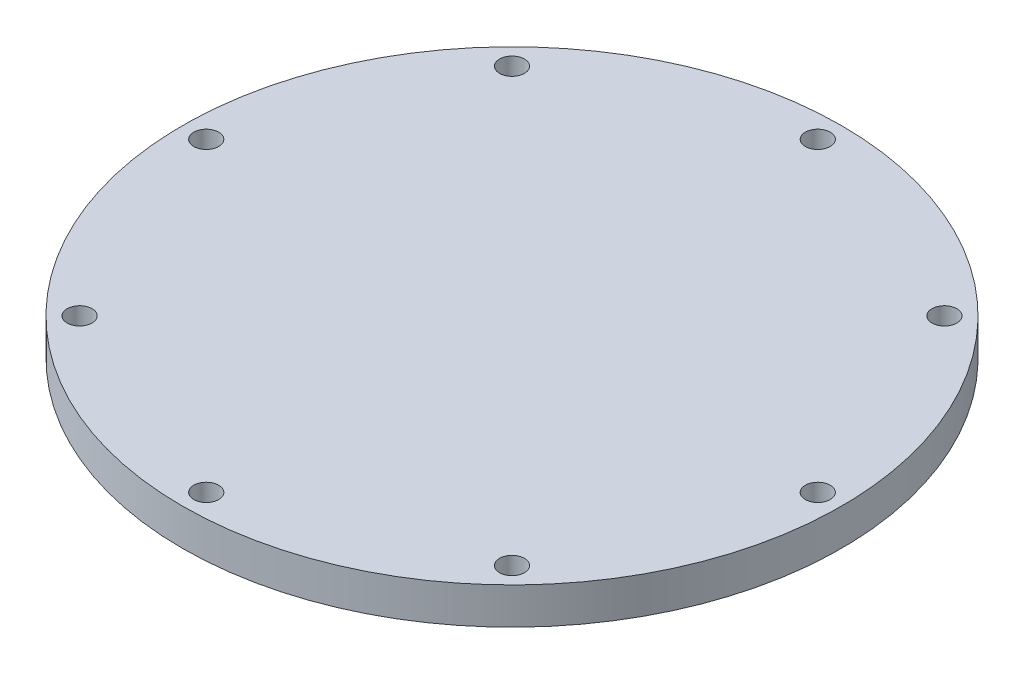
ISO-10303-21;
HEADER;
FILE_DESCRIPTION(('STEP AP214'),'2;1');
FILE_NAME('part.step','',(''),(''),'','','');
FILE_SCHEMA(('AUTOMOTIVE_DESIGN { 1 0 10303 214 1 1 1 1 }'));
ENDSEC;
DATA;
#1=APPLICATION_CONTEXT('core data for automotive mechanical design processes');
#2=APPLICATION_PROTOCOL_DEFINITION('international standard','automotive_design',2000,#1);
#3=PRODUCT_CONTEXT('',#1,'mechanical');
#4=PRODUCT('Part','Part','',(#3));
#5=PRODUCT_RELATED_PRODUCT_CATEGORY('part','',(#4));
#6=PRODUCT_DEFINITION_FORMATION('','',#4);
#7=PRODUCT_DEFINITION_CONTEXT('part definition',#1,'design');
#8=PRODUCT_DEFINITION('design','',#6,#7);
#9=PRODUCT_DEFINITION_SHAPE('','',#8);
#10=(LENGTH_UNIT() NAMED_UNIT(*) SI_UNIT(.MILLI.,.METRE.));
#11=(NAMED_UNIT(*) PLANE_ANGLE_UNIT() SI_UNIT($,.RADIAN.));
#12=(NAMED_UNIT(*) SI_UNIT($,.STERADIAN.) SOLID_ANGLE_UNIT());
#13=UNCERTAINTY_MEASURE_WITH_UNIT(LENGTH_MEASURE(1.E-05),#10,'distance_accuracy_value','');
#14=(GEOMETRIC_REPRESENTATION_CONTEXT(3) GLOBAL_UNCERTAINTY_ASSIGNED_CONTEXT((#13)) GLOBAL_UNIT_ASSIGNED_CONTEXT((#10,
#11,#12)) REPRESENTATION_CONTEXT('',''));
#15=CARTESIAN_POINT('',(0.,0.,0.));
#16=DIRECTION('',(0.,0.,1.));
#17=DIRECTION('',(1.,0.,0.));
#18=AXIS2_PLACEMENT_3D('',#15,#16,#17);
#19=CARTESIAN_POINT('',(0.,5.,0.));
#20=DIRECTION('',(0.,1.,0.));
#21=DIRECTION('',(0.,0.,1.));
#22=AXIS2_PLACEMENT_3D('',#19,#20,#21);
#23=PLANE('',#22);
#24=CARTESIAN_POINT('',(1.02206257963007E-12,5.,-41.7500000000013));
#25=DIRECTION('',(0.,1.,0.));
#26=DIRECTION('',(0.,0.,1.));
#27=AXIS2_PLACEMENT_3D('',#24,#25,#26);
#28=CIRCLE('',#27,1.7);
#29=CARTESIAN_POINT('',(1.02206257963007E-12,5.,-40.0500000000012));
#30=VERTEX_POINT('',#29);
#31=EDGE_CURVE('E100',#30,#30,#28,.T.);
#32=ORIENTED_EDGE('',*,*,#31,.F.);
#33=EDGE_LOOP('',(#32));
#34=FACE_BOUND('',#33,.T.);
#35=CARTESIAN_POINT('',(29.52170811454,5.,-29.5217081145385));
#36=DIRECTION('',(0.,1.,0.));
#37=DIRECTION('',(0.,0.,1.));
#38=AXIS2_PLACEMENT_3D('',#35,#36,#37);
#39=CIRCLE('',#38,1.7);
#40=CARTESIAN_POINT('',(29.52170811454,5.,-27.8217081145385));
#41=VERTEX_POINT('',#40);
#42=EDGE_CURVE('E104',#41,#41,#39,.T.);
#43=ORIENTED_EDGE('',*,*,#42,.F.);
#44=EDGE_LOOP('',(#43));
#45=FACE_BOUND('',#44,.T.);
#46=CARTESIAN_POINT('',(41.7500000000013,5.,1.16783192552678E-12));
#47=DIRECTION('',(0.,1.,0.));
#48=DIRECTION('',(0.,0.,1.));
#49=AXIS2_PLACEMENT_3D('',#46,#47,#48);
#50=CIRCLE('',#49,1.7);
#51=CARTESIAN_POINT('',(41.7500000000013,5.,1.70000000000117));
#52=VERTEX_POINT('',#51);
#53=EDGE_CURVE('E107',#52,#52,#50,.T.);
#54=ORIENTED_EDGE('',*,*,#53,.F.);
#55=EDGE_LOOP('',(#54));
#56=FACE_BOUND('',#55,.T.);
#57=CARTESIAN_POINT('',(29.5217081145384,5.,29.5217081145401));
#58=DIRECTION('',(0.,1.,0.));
#59=DIRECTION('',(0.,0.,1.));
#60=AXIS2_PLACEMENT_3D('',#57,#58,#59);
#61=CIRCLE('',#60,1.7);
#62=CARTESIAN_POINT('',(29.5217081145384,5.,31.2217081145401));
#63=VERTEX_POINT('',#62);
#64=EDGE_CURVE('E110',#63,#63,#61,.T.);
#65=ORIENTED_EDGE('',*,*,#64,.F.);
#66=EDGE_LOOP('',(#65));
#67=FACE_BOUND('',#66,.T.);
#68=CARTESIAN_POINT('',(-1.31360127142348E-12,5.,41.7500000000013));
#69=DIRECTION('',(0.,1.,0.));
#70=DIRECTION('',(0.,0.,1.));
#71=AXIS2_PLACEMENT_3D('',#68,#69,#70);
#72=CIRCLE('',#71,1.7);
#73=CARTESIAN_POINT('',(-1.31360127142348E-12,5.,43.4500000000013));
#74=VERTEX_POINT('',#73);
#75=EDGE_CURVE('E113',#74,#74,#72,.T.);
#76=ORIENTED_EDGE('',*,*,#75,.F.);
#77=EDGE_LOOP('',(#76));
#78=FACE_BOUND('',#77,.T.);
#79=CARTESIAN_POINT('',(-29.5217081145402,5.,29.5217081145383));
#80=DIRECTION('',(0.,1.,0.));
#81=DIRECTION('',(0.,0.,1.));
#82=AXIS2_PLACEMENT_3D('',#79,#80,#81);
#83=CIRCLE('',#82,1.7);
#84=CARTESIAN_POINT('',(-29.5217081145402,5.,31.2217081145383));
#85=VERTEX_POINT('',#84);
#86=EDGE_CURVE('E116',#85,#85,#83,.T.);
#87=ORIENTED_EDGE('',*,*,#86,.F.);
#88=EDGE_LOOP('',(#87));
#89=FACE_BOUND('',#88,.T.);
#90=CARTESIAN_POINT('',(-41.7500000000013,5.,-1.45937061732019E-12));
#91=DIRECTION('',(0.,1.,0.));
#92=DIRECTION('',(0.,0.,1.));
#93=AXIS2_PLACEMENT_3D('',#90,#91,#92);
#94=CIRCLE('',#93,1.7);
#95=CARTESIAN_POINT('',(-41.7500000000013,5.,1.69999999999854));
#96=VERTEX_POINT('',#95);
#97=EDGE_CURVE('E119',#96,#96,#94,.T.);
#98=ORIENTED_EDGE('',*,*,#97,.F.);
#99=EDGE_LOOP('',(#98));
#100=FACE_BOUND('',#99,.T.);
#101=CARTESIAN_POINT('',(-29.5217081145382,5.,-29.5217081145403));
#102=DIRECTION('',(0.,1.,0.));
#103=DIRECTION('',(0.,0.,1.));
#104=AXIS2_PLACEMENT_3D('',#101,#102,#103);
#105=CIRCLE('',#104,1.7);
#106=CARTESIAN_POINT('',(-29.5217081145382,5.,-27.8217081145403));
#107=VERTEX_POINT('',#106);
#108=EDGE_CURVE('E99',#107,#107,#105,.T.);
#109=ORIENTED_EDGE('',*,*,#108,.F.);
#110=EDGE_LOOP('',(#109));
#111=FACE_BOUND('',#110,.T.);
#112=CARTESIAN_POINT('',(0.,5.,0.));
#113=DIRECTION('',(0.,1.,0.));
#114=DIRECTION('',(0.,0.,1.));
#115=AXIS2_PLACEMENT_3D('',#112,#113,#114);
#116=CIRCLE('',#115,45.);
#117=CARTESIAN_POINT('',(0.,5.,45.));
#118=VERTEX_POINT('',#117);
#119=EDGE_CURVE('E137',#118,#118,#116,.T.);
#120=ORIENTED_EDGE('',*,*,#119,.T.);
#121=EDGE_LOOP('',(#120));
#122=FACE_BOUND('',#121,.T.);
#123=ADVANCED_FACE('F43',(#34,#45,#56,#67,#78,#89,#100,#111,#122),#23,.T.);
#124=CARTESIAN_POINT('',(0.,0.,0.));
#125=DIRECTION('',(0.,1.,0.));
#126=DIRECTION('',(0.,0.,1.));
#127=AXIS2_PLACEMENT_3D('',#124,#125,#126);
#128=PLANE('',#127);
#129=CARTESIAN_POINT('',(1.02206257963007E-12,0.,-41.7500000000013));
#130=DIRECTION('',(0.,1.,0.));
#131=DIRECTION('',(0.,0.,1.));
#132=AXIS2_PLACEMENT_3D('',#129,#130,#131);
#133=CIRCLE('',#132,1.7);
#134=CARTESIAN_POINT('',(1.02206257963007E-12,0.,-40.0500000000012));
#135=VERTEX_POINT('',#134);
#136=EDGE_CURVE('E47',#135,#135,#133,.T.);
#137=ORIENTED_EDGE('',*,*,#136,.T.);
#138=EDGE_LOOP('',(#137));
#139=FACE_BOUND('',#138,.T.);
#140=CARTESIAN_POINT('',(29.52170811454,0.,-29.5217081145385));
#141=DIRECTION('',(0.,1.,0.));
#142=DIRECTION('',(0.,0.,1.));
#143=AXIS2_PLACEMENT_3D('',#140,#141,#142);
#144=CIRCLE('',#143,1.7);
#145=CARTESIAN_POINT('',(29.52170811454,0.,-27.8217081145385));
#146=VERTEX_POINT('',#145);
#147=EDGE_CURVE('E166',#146,#146,#144,.T.);
#148=ORIENTED_EDGE('',*,*,#147,.T.);
#149=EDGE_LOOP('',(#148));
#150=FACE_BOUND('',#149,.T.);
#151=CARTESIAN_POINT('',(41.7500000000013,0.,1.16783192552678E-12));
#152=DIRECTION('',(0.,1.,0.));
#153=DIRECTION('',(0.,0.,1.));
#154=AXIS2_PLACEMENT_3D('',#151,#152,#153);
#155=CIRCLE('',#154,1.7);
#156=CARTESIAN_POINT('',(41.7500000000013,0.,1.70000000000117));
#157=VERTEX_POINT('',#156);
#158=EDGE_CURVE('E164',#157,#157,#155,.T.);
#159=ORIENTED_EDGE('',*,*,#158,.T.);
#160=EDGE_LOOP('',(#159));
#161=FACE_BOUND('',#160,.T.);
#162=CARTESIAN_POINT('',(29.5217081145384,0.,29.5217081145401));
#163=DIRECTION('',(0.,1.,0.));
#164=DIRECTION('',(0.,0.,1.));
#165=AXIS2_PLACEMENT_3D('',#162,#163,#164);
#166=CIRCLE('',#165,1.7);
#167=CARTESIAN_POINT('',(29.5217081145384,0.,31.2217081145401));
#168=VERTEX_POINT('',#167);
#169=EDGE_CURVE('E161',#168,#168,#166,.T.);
#170=ORIENTED_EDGE('',*,*,#169,.T.);
#171=EDGE_LOOP('',(#170));
#172=FACE_BOUND('',#171,.T.);
#173=CARTESIAN_POINT('',(-1.31360127142348E-12,0.,41.7500000000013));
#174=DIRECTION('',(0.,1.,0.));
#175=DIRECTION('',(0.,0.,1.));
#176=AXIS2_PLACEMENT_3D('',#173,#174,#175);
#177=CIRCLE('',#176,1.7);
#178=CARTESIAN_POINT('',(-1.31360127142348E-12,0.,43.4500000000013));
#179=VERTEX_POINT('',#178);
#180=EDGE_CURVE('E158',#179,#179,#177,.T.);
#181=ORIENTED_EDGE('',*,*,#180,.T.);
#182=EDGE_LOOP('',(#181));
#183=FACE_BOUND('',#182,.T.);
#184=CARTESIAN_POINT('',(-29.5217081145402,0.,29.5217081145383));
#185=DIRECTION('',(0.,1.,0.));
#186=DIRECTION('',(0.,0.,1.));
#187=AXIS2_PLACEMENT_3D('',#184,#185,#186);
#188=CIRCLE('',#187,1.7);
#189=CARTESIAN_POINT('',(-29.5217081145402,0.,31.2217081145383));
#190=VERTEX_POINT('',#189);
#191=EDGE_CURVE('E155',#190,#190,#188,.T.);
#192=ORIENTED_EDGE('',*,*,#191,.T.);
#193=EDGE_LOOP('',(#192));
#194=FACE_BOUND('',#193,.T.);
#195=CARTESIAN_POINT('',(-41.7500000000013,0.,-1.45937061732019E-12));
#196=DIRECTION('',(0.,1.,0.));
#197=DIRECTION('',(0.,0.,1.));
#198=AXIS2_PLACEMENT_3D('',#195,#196,#197);
#199=CIRCLE('',#198,1.7);
#200=CARTESIAN_POINT('',(-41.7500000000013,0.,1.69999999999854));
#201=VERTEX_POINT('',#200);
#202=EDGE_CURVE('E152',#201,#201,#199,.T.);
#203=ORIENTED_EDGE('',*,*,#202,.T.);
#204=EDGE_LOOP('',(#203));
#205=FACE_BOUND('',#204,.T.);
#206=CARTESIAN_POINT('',(-29.5217081145382,0.,-29.5217081145403));
#207=DIRECTION('',(0.,1.,0.));
#208=DIRECTION('',(0.,0.,1.));
#209=AXIS2_PLACEMENT_3D('',#206,#207,#208);
#210=CIRCLE('',#209,1.7);
#211=CARTESIAN_POINT('',(-29.5217081145382,0.,-27.8217081145403));
#212=VERTEX_POINT('',#211);
#213=EDGE_CURVE('E103',#212,#212,#210,.T.);
#214=ORIENTED_EDGE('',*,*,#213,.T.);
#215=EDGE_LOOP('',(#214));
#216=FACE_BOUND('',#215,.T.);
#217=CARTESIAN_POINT('',(27.,0.,0.));
#218=DIRECTION('',(0.,1.,0.));
#219=DIRECTION('',(0.,0.,1.));
#220=AXIS2_PLACEMENT_3D('',#217,#218,#219);
#221=CIRCLE('',#220,3.937);
#222=CARTESIAN_POINT('',(27.,0.,3.937));
#223=VERTEX_POINT('',#222);
#224=EDGE_CURVE('E11',#223,#223,#221,.F.);
#225=ORIENTED_EDGE('',*,*,#224,.F.);
#226=EDGE_LOOP('',(#225));
#227=FACE_BOUND('',#226,.T.);
#228=CARTESIAN_POINT('',(0.,0.,-27.));
#229=DIRECTION('',(0.,1.,0.));
#230=DIRECTION('',(0.,0.,1.));
#231=AXIS2_PLACEMENT_3D('',#228,#229,#230);
#232=CIRCLE('',#231,3.937);
#233=CARTESIAN_POINT('',(0.,0.,-23.063));
#234=VERTEX_POINT('',#233);
#235=EDGE_CURVE('E52',#234,#234,#232,.F.);
#236=ORIENTED_EDGE('',*,*,#235,.F.);
#237=EDGE_LOOP('',(#236));
#238=FACE_BOUND('',#237,.T.);
#239=CARTESIAN_POINT('',(-27.,0.,1.88539992297529E-13));
#240=DIRECTION('',(0.,1.,0.));
#241=DIRECTION('',(0.,0.,1.));
#242=AXIS2_PLACEMENT_3D('',#239,#240,#241);
#243=CIRCLE('',#242,3.937);
#244=CARTESIAN_POINT('',(-27.,0.,3.93700000000019));
#245=VERTEX_POINT('',#244);
#246=EDGE_CURVE('E145',#245,#245,#243,.F.);
#247=ORIENTED_EDGE('',*,*,#246,.F.);
#248=EDGE_LOOP('',(#247));
#249=FACE_BOUND('',#248,.T.);
#250=CARTESIAN_POINT('',(2.82809988446294E-13,0.,27.));
#251=DIRECTION('',(0.,1.,0.));
#252=DIRECTION('',(0.,0.,1.));
#253=AXIS2_PLACEMENT_3D('',#250,#251,#252);
#254=CIRCLE('',#253,3.937);
#255=CARTESIAN_POINT('',(2.82809988446294E-13,0.,30.937));
#256=VERTEX_POINT('',#255);
#257=EDGE_CURVE('E140',#256,#256,#254,.F.);
#258=ORIENTED_EDGE('',*,*,#257,.F.);
#259=EDGE_LOOP('',(#258));
#260=FACE_BOUND('',#259,.T.);
#261=CARTESIAN_POINT('',(0.,0.,0.));
#262=DIRECTION('',(0.,1.,0.));
#263=DIRECTION('',(0.,0.,1.));
#264=AXIS2_PLACEMENT_3D('',#261,#262,#263);
#265=CIRCLE('',#264,45.);
#266=CARTESIAN_POINT('',(0.,0.,45.));
#267=VERTEX_POINT('',#266);
#268=EDGE_CURVE('E127',#267,#267,#265,.T.);
#269=ORIENTED_EDGE('',*,*,#268,.F.);
#270=EDGE_LOOP('',(#269));
#271=FACE_BOUND('',#270,.T.);
#272=ADVANCED_FACE('F173',(#139,#150,#161,#172,#183,#194,#205,#216,#227,#238,#249,#260,#271),
#128,.F.);
#273=CARTESIAN_POINT('',(0.,5.,0.));
#274=DIRECTION('',(0.,-1.,0.));
#275=DIRECTION('',(0.,0.,-1.));
#276=AXIS2_PLACEMENT_3D('',#273,#274,#275);
#277=CYLINDRICAL_SURFACE('',#276,45.);
#278=ORIENTED_EDGE('',*,*,#119,.F.);
#279=EDGE_LOOP('',(#278));
#280=FACE_BOUND('',#279,.T.);
#281=ORIENTED_EDGE('',*,*,#268,.T.);
#282=EDGE_LOOP('',(#281));
#283=FACE_BOUND('',#282,.T.);
#284=ADVANCED_FACE('F45',(#280,#283),#277,.T.);
#285=CARTESIAN_POINT('',(2.82809988446294E-13,-4.,27.));
#286=DIRECTION('',(0.,1.,0.));
#287=DIRECTION('',(0.,0.,1.));
#288=AXIS2_PLACEMENT_3D('',#285,#286,#287);
#289=CYLINDRICAL_SURFACE('',#288,3.937);
#290=CARTESIAN_POINT('',(2.82809988446294E-13,-4.,27.));
#291=DIRECTION('',(0.,-1.,0.));
#292=DIRECTION('',(0.,0.,-1.));
#293=AXIS2_PLACEMENT_3D('',#290,#291,#292);
#294=CIRCLE('',#293,3.937);
#295=CARTESIAN_POINT('',(2.82809988446294E-13,-4.,23.063));
#296=VERTEX_POINT('',#295);
#297=EDGE_CURVE('E134',#296,#296,#294,.T.);
#298=ORIENTED_EDGE('',*,*,#297,.F.);
#299=EDGE_LOOP('',(#298));
#300=FACE_BOUND('',#299,.T.);
#301=ORIENTED_EDGE('',*,*,#257,.T.);
#302=EDGE_LOOP('',(#301));
#303=FACE_BOUND('',#302,.T.);
#304=ADVANCED_FACE('F205',(#300,#303),#289,.T.);
#305=CARTESIAN_POINT('',(2.82809988446294E-13,-4.,27.));
#306=DIRECTION('',(0.,-1.,0.));
#307=DIRECTION('',(0.,0.,-1.));
#308=AXIS2_PLACEMENT_3D('',#305,#306,#307);
#309=PLANE('',#308);
#310=CARTESIAN_POINT('',(2.82809988446294E-13,-4.,27.));
#311=DIRECTION('',(0.,-1.,0.));
#312=DIRECTION('',(0.,0.,-1.));
#313=AXIS2_PLACEMENT_3D('',#310,#311,#312);
#314=CIRCLE('',#313,1.24999999999999);
#315=CARTESIAN_POINT('',(2.82809988446294E-13,-4.,25.75));
#316=VERTEX_POINT('',#315);
#317=EDGE_CURVE('E77',#316,#316,#314,.T.);
#318=ORIENTED_EDGE('',*,*,#317,.F.);
#319=EDGE_LOOP('',(#318));
#320=FACE_BOUND('',#319,.T.);
#321=ORIENTED_EDGE('',*,*,#297,.T.);
#322=EDGE_LOOP('',(#321));
#323=FACE_BOUND('',#322,.T.);
#324=ADVANCED_FACE('F201',(#320,#323),#309,.T.);
#325=CARTESIAN_POINT('',(-27.,-4.,1.88539992297529E-13));
#326=DIRECTION('',(0.,1.,0.));
#327=DIRECTION('',(0.,0.,1.));
#328=AXIS2_PLACEMENT_3D('',#325,#326,#327);
#329=CYLINDRICAL_SURFACE('',#328,3.937);
#330=CARTESIAN_POINT('',(-27.,-4.,1.88539992297529E-13));
#331=DIRECTION('',(0.,-1.,0.));
#332=DIRECTION('',(0.,0.,-1.));
#333=AXIS2_PLACEMENT_3D('',#330,#331,#332);
#334=CIRCLE('',#333,3.937);
#335=CARTESIAN_POINT('',(-27.,-4.,-3.93699999999981));
#336=VERTEX_POINT('',#335);
#337=EDGE_CURVE('E131',#336,#336,#334,.T.);
#338=ORIENTED_EDGE('',*,*,#337,.F.);
#339=EDGE_LOOP('',(#338));
#340=FACE_BOUND('',#339,.T.);
#341=ORIENTED_EDGE('',*,*,#246,.T.);
#342=EDGE_LOOP('',(#341));
#343=FACE_BOUND('',#342,.T.);
#344=ADVANCED_FACE('F204',(#340,#343),#329,.T.);
#345=CARTESIAN_POINT('',(-27.,-4.,1.88539992297529E-13));
#346=DIRECTION('',(0.,-1.,0.));
#347=DIRECTION('',(0.,0.,-1.));
#348=AXIS2_PLACEMENT_3D('',#345,#346,#347);
#349=PLANE('',#348);
#350=CARTESIAN_POINT('',(-27.,-4.,1.88539992297529E-13));
#351=DIRECTION('',(0.,-1.,0.));
#352=DIRECTION('',(0.,0.,-1.));
#353=AXIS2_PLACEMENT_3D('',#350,#351,#352);
#354=CIRCLE('',#353,1.24999999999999);
#355=CARTESIAN_POINT('',(-27.,-4.,-1.2499999999998));
#356=VERTEX_POINT('',#355);
#357=EDGE_CURVE('E93',#356,#356,#354,.T.);
#358=ORIENTED_EDGE('',*,*,#357,.F.);
#359=EDGE_LOOP('',(#358));
#360=FACE_BOUND('',#359,.T.);
#361=ORIENTED_EDGE('',*,*,#337,.T.);
#362=EDGE_LOOP('',(#361));
#363=FACE_BOUND('',#362,.T.);
#364=ADVANCED_FACE('F210',(#360,#363),#349,.T.);
#365=CARTESIAN_POINT('',(0.,-4.,-27.));
#366=DIRECTION('',(0.,1.,0.));
#367=DIRECTION('',(0.,0.,1.));
#368=AXIS2_PLACEMENT_3D('',#365,#366,#367);
#369=CYLINDRICAL_SURFACE('',#368,3.937);
#370=CARTESIAN_POINT('',(0.,-4.,-27.));
#371=DIRECTION('',(0.,-1.,0.));
#372=DIRECTION('',(0.,0.,-1.));
#373=AXIS2_PLACEMENT_3D('',#370,#371,#372);
#374=CIRCLE('',#373,3.937);
#375=CARTESIAN_POINT('',(0.,-4.,-30.937));
#376=VERTEX_POINT('',#375);
#377=EDGE_CURVE('E128',#376,#376,#374,.T.);
#378=ORIENTED_EDGE('',*,*,#377,.F.);
#379=EDGE_LOOP('',(#378));
#380=FACE_BOUND('',#379,.T.);
#381=ORIENTED_EDGE('',*,*,#235,.T.);
#382=EDGE_LOOP('',(#381));
#383=FACE_BOUND('',#382,.T.);
#384=ADVANCED_FACE('F213',(#380,#383),#369,.T.);
#385=CARTESIAN_POINT('',(0.,-4.,-27.));
#386=DIRECTION('',(0.,-1.,0.));
#387=DIRECTION('',(0.,0.,-1.));
#388=AXIS2_PLACEMENT_3D('',#385,#386,#387);
#389=PLANE('',#388);
#390=CARTESIAN_POINT('',(0.,-4.,-27.));
#391=DIRECTION('',(0.,-1.,0.));
#392=DIRECTION('',(0.,0.,-1.));
#393=AXIS2_PLACEMENT_3D('',#390,#391,#392);
#394=CIRCLE('',#393,1.24999999999999);
#395=CARTESIAN_POINT('',(0.,-4.,-28.25));
#396=VERTEX_POINT('',#395);
#397=EDGE_CURVE('E87',#396,#396,#394,.T.);
#398=ORIENTED_EDGE('',*,*,#397,.F.);
#399=EDGE_LOOP('',(#398));
#400=FACE_BOUND('',#399,.T.);
#401=ORIENTED_EDGE('',*,*,#377,.T.);
#402=EDGE_LOOP('',(#401));
#403=FACE_BOUND('',#402,.T.);
#404=ADVANCED_FACE('F218',(#400,#403),#389,.T.);
#405=CARTESIAN_POINT('',(27.,-4.,0.));
#406=DIRECTION('',(0.,1.,0.));
#407=DIRECTION('',(0.,0.,1.));
#408=AXIS2_PLACEMENT_3D('',#405,#406,#407);
#409=CYLINDRICAL_SURFACE('',#408,3.937);
#410=CARTESIAN_POINT('',(27.,-4.,0.));
#411=DIRECTION('',(0.,-1.,0.));
#412=DIRECTION('',(0.,0.,-1.));
#413=AXIS2_PLACEMENT_3D('',#410,#411,#412);
#414=CIRCLE('',#413,3.937);
#415=CARTESIAN_POINT('',(27.,-4.,-3.937));
#416=VERTEX_POINT('',#415);
#417=EDGE_CURVE('E124',#416,#416,#414,.T.);
#418=ORIENTED_EDGE('',*,*,#417,.F.);
#419=EDGE_LOOP('',(#418));
#420=FACE_BOUND('',#419,.T.);
#421=ORIENTED_EDGE('',*,*,#224,.T.);
#422=EDGE_LOOP('',(#421));
#423=FACE_BOUND('',#422,.T.);
#424=ADVANCED_FACE('F221',(#420,#423),#409,.T.);
#425=CARTESIAN_POINT('',(27.,-4.,0.));
#426=DIRECTION('',(0.,-1.,0.));
#427=DIRECTION('',(0.,0.,-1.));
#428=AXIS2_PLACEMENT_3D('',#425,#426,#427);
#429=PLANE('',#428);
#430=CARTESIAN_POINT('',(27.,-4.,0.));
#431=DIRECTION('',(0.,-1.,0.));
#432=DIRECTION('',(0.,0.,-1.));
#433=AXIS2_PLACEMENT_3D('',#430,#431,#432);
#434=CIRCLE('',#433,1.24999999999999);
#435=CARTESIAN_POINT('',(27.,-4.,-1.24999999999999));
#436=VERTEX_POINT('',#435);
#437=EDGE_CURVE('E76',#436,#436,#434,.T.);
#438=ORIENTED_EDGE('',*,*,#437,.F.);
#439=EDGE_LOOP('',(#438));
#440=FACE_BOUND('',#439,.T.);
#441=ORIENTED_EDGE('',*,*,#417,.T.);
#442=EDGE_LOOP('',(#441));
#443=FACE_BOUND('',#442,.T.);
#444=ADVANCED_FACE('F227',(#440,#443),#429,.T.);
#445=CARTESIAN_POINT('',(-29.5217081145382,-9.,-29.5217081145403));
#446=DIRECTION('',(0.,1.,0.));
#447=DIRECTION('',(0.,0.,1.));
#448=AXIS2_PLACEMENT_3D('',#445,#446,#447);
#449=CYLINDRICAL_SURFACE('',#448,1.7);
#450=ORIENTED_EDGE('',*,*,#108,.T.);
#451=EDGE_LOOP('',(#450));
#452=FACE_BOUND('',#451,.T.);
#453=ORIENTED_EDGE('',*,*,#213,.F.);
#454=EDGE_LOOP('',(#453));
#455=FACE_BOUND('',#454,.T.);
#456=ADVANCED_FACE('F231',(#452,#455),#449,.F.);
#457=CARTESIAN_POINT('',(-41.7500000000013,-9.,-1.45937061732019E-12));
#458=DIRECTION('',(0.,1.,0.));
#459=DIRECTION('',(0.,0.,1.));
#460=AXIS2_PLACEMENT_3D('',#457,#458,#459);
#461=CYLINDRICAL_SURFACE('',#460,1.7);
#462=ORIENTED_EDGE('',*,*,#97,.T.);
#463=EDGE_LOOP('',(#462));
#464=FACE_BOUND('',#463,.T.);
#465=ORIENTED_EDGE('',*,*,#202,.F.);
#466=EDGE_LOOP('',(#465));
#467=FACE_BOUND('',#466,.T.);
#468=ADVANCED_FACE('F235',(#464,#467),#461,.F.);
#469=CARTESIAN_POINT('',(-29.5217081145402,-9.,29.5217081145383));
#470=DIRECTION('',(0.,1.,0.));
#471=DIRECTION('',(0.,0.,1.));
#472=AXIS2_PLACEMENT_3D('',#469,#470,#471);
#473=CYLINDRICAL_SURFACE('',#472,1.7);
#474=ORIENTED_EDGE('',*,*,#86,.T.);
#475=EDGE_LOOP('',(#474));
#476=FACE_BOUND('',#475,.T.);
#477=ORIENTED_EDGE('',*,*,#191,.F.);
#478=EDGE_LOOP('',(#477));
#479=FACE_BOUND('',#478,.T.);
#480=ADVANCED_FACE('F239',(#476,#479),#473,.F.);
#481=CARTESIAN_POINT('',(-1.31360127142348E-12,-9.,41.7500000000013));
#482=DIRECTION('',(0.,1.,0.));
#483=DIRECTION('',(0.,0.,1.));
#484=AXIS2_PLACEMENT_3D('',#481,#482,#483);
#485=CYLINDRICAL_SURFACE('',#484,1.7);
#486=ORIENTED_EDGE('',*,*,#75,.T.);
#487=EDGE_LOOP('',(#486));
#488=FACE_BOUND('',#487,.T.);
#489=ORIENTED_EDGE('',*,*,#180,.F.);
#490=EDGE_LOOP('',(#489));
#491=FACE_BOUND('',#490,.T.);
#492=ADVANCED_FACE('F243',(#488,#491),#485,.F.);
#493=CARTESIAN_POINT('',(29.5217081145384,-9.,29.5217081145401));
#494=DIRECTION('',(0.,1.,0.));
#495=DIRECTION('',(0.,0.,1.));
#496=AXIS2_PLACEMENT_3D('',#493,#494,#495);
#497=CYLINDRICAL_SURFACE('',#496,1.7);
#498=ORIENTED_EDGE('',*,*,#64,.T.);
#499=EDGE_LOOP('',(#498));
#500=FACE_BOUND('',#499,.T.);
#501=ORIENTED_EDGE('',*,*,#169,.F.);
#502=EDGE_LOOP('',(#501));
#503=FACE_BOUND('',#502,.T.);
#504=ADVANCED_FACE('F247',(#500,#503),#497,.F.);
#505=CARTESIAN_POINT('',(41.7500000000013,-9.,1.16783192552678E-12));
#506=DIRECTION('',(0.,1.,0.));
#507=DIRECTION('',(0.,0.,1.));
#508=AXIS2_PLACEMENT_3D('',#505,#506,#507);
#509=CYLINDRICAL_SURFACE('',#508,1.7);
#510=ORIENTED_EDGE('',*,*,#53,.T.);
#511=EDGE_LOOP('',(#510));
#512=FACE_BOUND('',#511,.T.);
#513=ORIENTED_EDGE('',*,*,#158,.F.);
#514=EDGE_LOOP('',(#513));
#515=FACE_BOUND('',#514,.T.);
#516=ADVANCED_FACE('F188',(#512,#515),#509,.F.);
#517=CARTESIAN_POINT('',(29.52170811454,-9.,-29.5217081145385));
#518=DIRECTION('',(0.,1.,0.));
#519=DIRECTION('',(0.,0.,1.));
#520=AXIS2_PLACEMENT_3D('',#517,#518,#519);
#521=CYLINDRICAL_SURFACE('',#520,1.7);
#522=ORIENTED_EDGE('',*,*,#42,.T.);
#523=EDGE_LOOP('',(#522));
#524=FACE_BOUND('',#523,.T.);
#525=ORIENTED_EDGE('',*,*,#147,.F.);
#526=EDGE_LOOP('',(#525));
#527=FACE_BOUND('',#526,.T.);
#528=ADVANCED_FACE('F178',(#524,#527),#521,.F.);
#529=CARTESIAN_POINT('',(1.02206257963007E-12,-9.,-41.7500000000013));
#530=DIRECTION('',(0.,1.,0.));
#531=DIRECTION('',(0.,0.,1.));
#532=AXIS2_PLACEMENT_3D('',#529,#530,#531);
#533=CYLINDRICAL_SURFACE('',#532,1.7);
#534=ORIENTED_EDGE('',*,*,#31,.T.);
#535=EDGE_LOOP('',(#534));
#536=FACE_BOUND('',#535,.T.);
#537=ORIENTED_EDGE('',*,*,#136,.F.);
#538=EDGE_LOOP('',(#537));
#539=FACE_BOUND('',#538,.T.);
#540=ADVANCED_FACE('F175',(#536,#539),#533,.F.);
#541=CARTESIAN_POINT('',(-27.,3.,1.88539992297529E-13));
#542=DIRECTION('',(0.,-1.,0.));
#543=DIRECTION('',(0.,0.,-1.));
#544=AXIS2_PLACEMENT_3D('',#541,#542,#543);
#545=CONICAL_SURFACE('',#544,1.25,1.02974425867665);
#546=CARTESIAN_POINT('',(-27.,3.75107577378445,1.88539992297529E-13));
#547=VERTEX_POINT('',#546);
#548=VERTEX_LOOP('',#547);
#549=FACE_BOUND('',#548,.T.);
#550=CARTESIAN_POINT('',(-27.,3.,1.88539992297529E-13));
#551=DIRECTION('',(0.,-1.,0.));
#552=DIRECTION('',(0.,0.,-1.));
#553=AXIS2_PLACEMENT_3D('',#550,#551,#552);
#554=CIRCLE('',#553,1.25);
#555=CARTESIAN_POINT('',(-27.,3.,-1.24999999999981));
#556=VERTEX_POINT('',#555);
#557=EDGE_CURVE('E96',#556,#556,#554,.T.);
#558=ORIENTED_EDGE('',*,*,#557,.T.);
#559=EDGE_LOOP('',(#558));
#560=FACE_BOUND('',#559,.T.);
#561=ADVANCED_FACE('F177',(#549,#560),#545,.F.);
#562=CARTESIAN_POINT('',(-27.,-4.,1.88539992297529E-13));
#563=DIRECTION('',(0.,-1.,0.));
#564=DIRECTION('',(0.,0.,-1.));
#565=AXIS2_PLACEMENT_3D('',#562,#563,#564);
#566=CYLINDRICAL_SURFACE('',#565,1.24999999999999);
#567=ORIENTED_EDGE('',*,*,#557,.F.);
#568=EDGE_LOOP('',(#567));
#569=FACE_BOUND('',#568,.T.);
#570=ORIENTED_EDGE('',*,*,#357,.T.);
#571=EDGE_LOOP('',(#570));
#572=FACE_BOUND('',#571,.T.);
#573=ADVANCED_FACE('F186',(#569,#572),#566,.F.);
#574=CARTESIAN_POINT('',(0.,3.,-27.));
#575=DIRECTION('',(0.,-1.,0.));
#576=DIRECTION('',(0.,0.,-1.));
#577=AXIS2_PLACEMENT_3D('',#574,#575,#576);
#578=CONICAL_SURFACE('',#577,1.25,1.02974425867665);
#579=CARTESIAN_POINT('',(0.,3.75107577378445,-27.));
#580=VERTEX_POINT('',#579);
#581=VERTEX_LOOP('',#580);
#582=FACE_BOUND('',#581,.T.);
#583=CARTESIAN_POINT('',(0.,3.,-27.));
#584=DIRECTION('',(0.,-1.,0.));
#585=DIRECTION('',(0.,0.,-1.));
#586=AXIS2_PLACEMENT_3D('',#583,#584,#585);
#587=CIRCLE('',#586,1.25);
#588=CARTESIAN_POINT('',(0.,3.,-28.25));
#589=VERTEX_POINT('',#588);
#590=EDGE_CURVE('E90',#589,#589,#587,.T.);
#591=ORIENTED_EDGE('',*,*,#590,.T.);
#592=EDGE_LOOP('',(#591));
#593=FACE_BOUND('',#592,.T.);
#594=ADVANCED_FACE('F384',(#582,#593),#578,.F.);
#595=CARTESIAN_POINT('',(0.,-4.,-27.));
#596=DIRECTION('',(0.,-1.,0.));
#597=DIRECTION('',(0.,0.,-1.));
#598=AXIS2_PLACEMENT_3D('',#595,#596,#597);
#599=CYLINDRICAL_SURFACE('',#598,1.24999999999999);
#600=ORIENTED_EDGE('',*,*,#590,.F.);
#601=EDGE_LOOP('',(#600));
#602=FACE_BOUND('',#601,.T.);
#603=ORIENTED_EDGE('',*,*,#397,.T.);
#604=EDGE_LOOP('',(#603));
#605=FACE_BOUND('',#604,.T.);
#606=ADVANCED_FACE('F395',(#602,#605),#599,.F.);
#607=CARTESIAN_POINT('',(27.,3.,0.));
#608=DIRECTION('',(0.,-1.,0.));
#609=DIRECTION('',(0.,0.,-1.));
#610=AXIS2_PLACEMENT_3D('',#607,#608,#609);
#611=CONICAL_SURFACE('',#610,1.25,1.02974425867665);
#612=CARTESIAN_POINT('',(27.,3.75107577378445,0.));
#613=VERTEX_POINT('',#612);
#614=VERTEX_LOOP('',#613);
#615=FACE_BOUND('',#614,.T.);
#616=CARTESIAN_POINT('',(27.,3.,0.));
#617=DIRECTION('',(0.,-1.,0.));
#618=DIRECTION('',(0.,0.,-1.));
#619=AXIS2_PLACEMENT_3D('',#616,#617,#618);
#620=CIRCLE('',#619,1.25);
#621=CARTESIAN_POINT('',(27.,3.,-1.25));
#622=VERTEX_POINT('',#621);
#623=EDGE_CURVE('E80',#622,#622,#620,.T.);
#624=ORIENTED_EDGE('',*,*,#623,.T.);
#625=EDGE_LOOP('',(#624));
#626=FACE_BOUND('',#625,.T.);
#627=ADVANCED_FACE('F405',(#615,#626),#611,.F.);
#628=CARTESIAN_POINT('',(27.,-4.,0.));
#629=DIRECTION('',(0.,-1.,0.));
#630=DIRECTION('',(0.,0.,-1.));
#631=AXIS2_PLACEMENT_3D('',#628,#629,#630);
#632=CYLINDRICAL_SURFACE('',#631,1.24999999999999);
#633=ORIENTED_EDGE('',*,*,#623,.F.);
#634=EDGE_LOOP('',(#633));
#635=FACE_BOUND('',#634,.T.);
#636=ORIENTED_EDGE('',*,*,#437,.T.);
#637=EDGE_LOOP('',(#636));
#638=FACE_BOUND('',#637,.T.);
#639=ADVANCED_FACE('F70',(#635,#638),#632,.F.);
#640=CARTESIAN_POINT('',(2.82809988446294E-13,3.,27.));
#641=DIRECTION('',(0.,-1.,0.));
#642=DIRECTION('',(0.,0.,-1.));
#643=AXIS2_PLACEMENT_3D('',#640,#641,#642);
#644=CONICAL_SURFACE('',#643,1.25,1.02974425867665);
#645=CARTESIAN_POINT('',(2.80911522419031E-13,3.75107577378445,27.));
#646=VERTEX_POINT('',#645);
#647=VERTEX_LOOP('',#646);
#648=FACE_BOUND('',#647,.T.);
#649=CARTESIAN_POINT('',(2.82809988446294E-13,3.,27.));
#650=DIRECTION('',(0.,-1.,0.));
#651=DIRECTION('',(0.,0.,-1.));
#652=AXIS2_PLACEMENT_3D('',#649,#650,#651);
#653=CIRCLE('',#652,1.25);
#654=CARTESIAN_POINT('',(2.82809988446294E-13,3.,25.75));
#655=VERTEX_POINT('',#654);
#656=EDGE_CURVE('E74',#655,#655,#653,.T.);
#657=ORIENTED_EDGE('',*,*,#656,.T.);
#658=EDGE_LOOP('',(#657));
#659=FACE_BOUND('',#658,.T.);
#660=ADVANCED_FACE('F66',(#648,#659),#644,.F.);
#661=CARTESIAN_POINT('',(2.82809988446294E-13,-4.,27.));
#662=DIRECTION('',(0.,-1.,0.));
#663=DIRECTION('',(0.,0.,-1.));
#664=AXIS2_PLACEMENT_3D('',#661,#662,#663);
#665=CYLINDRICAL_SURFACE('',#664,1.24999999999999);
#666=ORIENTED_EDGE('',*,*,#656,.F.);
#667=EDGE_LOOP('',(#666));
#668=FACE_BOUND('',#667,.T.);
#669=ORIENTED_EDGE('',*,*,#317,.T.);
#670=EDGE_LOOP('',(#669));
#671=FACE_BOUND('',#670,.T.);
#672=ADVANCED_FACE('F69',(#668,#671),#665,.F.);
#673=CLOSED_SHELL('',(#123,#272,#284,#304,#324,#344,#364,#384,#404,#424,#444,#456,#468,#480,
#492,#504,#516,#528,#540,#561,#573,#594,#606,#627,#639,#660,#672));
#674=MANIFOLD_SOLID_BREP('B2',#673);
#675=ADVANCED_BREP_SHAPE_REPRESENTATION('',(#18,#674),#14);
#676=SHAPE_DEFINITION_REPRESENTATION(#9,#675);
ENDSEC;
END-ISO-10303-21;
